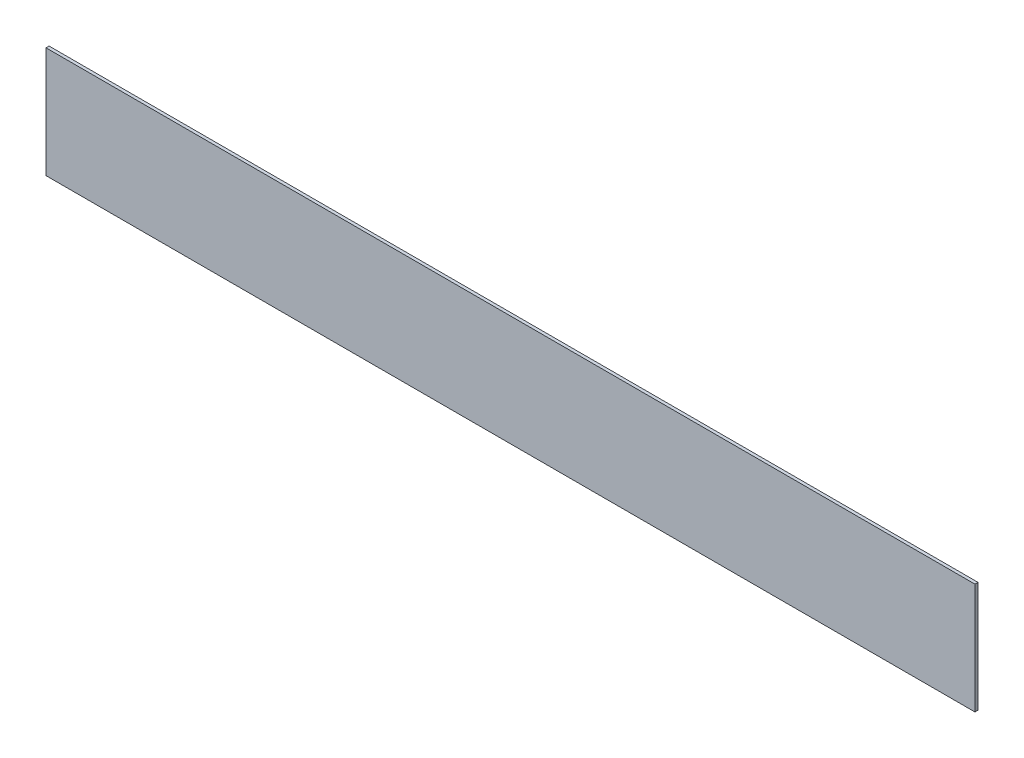
ISO-10303-21;
HEADER;
FILE_DESCRIPTION(('STEP AP214'),'2;1');
FILE_NAME('part.step','',(''),(''),'','','');
FILE_SCHEMA(('AUTOMOTIVE_DESIGN { 1 0 10303 214 1 1 1 1 }'));
ENDSEC;
DATA;
#1=APPLICATION_CONTEXT('core data for automotive mechanical design processes');
#2=APPLICATION_PROTOCOL_DEFINITION('international standard','automotive_design',2000,#1);
#3=PRODUCT_CONTEXT('',#1,'mechanical');
#4=PRODUCT('Part','Part','',(#3));
#5=PRODUCT_RELATED_PRODUCT_CATEGORY('part','',(#4));
#6=PRODUCT_DEFINITION_FORMATION('','',#4);
#7=PRODUCT_DEFINITION_CONTEXT('part definition',#1,'design');
#8=PRODUCT_DEFINITION('design','',#6,#7);
#9=PRODUCT_DEFINITION_SHAPE('','',#8);
#10=(LENGTH_UNIT() NAMED_UNIT(*) SI_UNIT(.MILLI.,.METRE.));
#11=(NAMED_UNIT(*) PLANE_ANGLE_UNIT() SI_UNIT($,.RADIAN.));
#12=(NAMED_UNIT(*) SI_UNIT($,.STERADIAN.) SOLID_ANGLE_UNIT());
#13=UNCERTAINTY_MEASURE_WITH_UNIT(LENGTH_MEASURE(1.E-05),#10,'distance_accuracy_value','');
#14=(GEOMETRIC_REPRESENTATION_CONTEXT(3) GLOBAL_UNCERTAINTY_ASSIGNED_CONTEXT((#13)) GLOBAL_UNIT_ASSIGNED_CONTEXT((#10,
#11,#12)) REPRESENTATION_CONTEXT('',''));
#15=CARTESIAN_POINT('',(0.,0.,0.));
#16=DIRECTION('',(0.,0.,1.));
#17=DIRECTION('',(1.,0.,0.));
#18=AXIS2_PLACEMENT_3D('',#15,#16,#17);
#19=CARTESIAN_POINT('',(158.,27.,27.));
#20=DIRECTION('',(1.,0.,0.));
#21=DIRECTION('',(0.,0.,-1.));
#22=AXIS2_PLACEMENT_3D('',#19,#20,#21);
#23=PLANE('',#22);
#24=DIRECTION('',(0.,-1.,0.));
#25=VECTOR('',#24,1.);
#26=CARTESIAN_POINT('',(158.,27.,26.));
#27=LINE('',#26,#25);
#28=CARTESIAN_POINT('',(158.,63.,26.));
#29=VERTEX_POINT('',#28);
#30=CARTESIAN_POINT('',(158.,27.,26.));
#31=VERTEX_POINT('',#30);
#32=EDGE_CURVE('E102',#29,#31,#27,.T.);
#33=ORIENTED_EDGE('',*,*,#32,.T.);
#34=DIRECTION('',(0.,0.,-1.));
#35=VECTOR('',#34,1.);
#36=CARTESIAN_POINT('',(158.,27.,27.));
#37=LINE('',#36,#35);
#38=CARTESIAN_POINT('',(158.,27.,27.));
#39=VERTEX_POINT('',#38);
#40=EDGE_CURVE('E11',#39,#31,#37,.T.);
#41=ORIENTED_EDGE('',*,*,#40,.F.);
#42=DIRECTION('',(0.,-1.,0.));
#43=VECTOR('',#42,1.);
#44=CARTESIAN_POINT('',(158.,27.,27.));
#45=LINE('',#44,#43);
#46=CARTESIAN_POINT('',(158.,63.,27.));
#47=VERTEX_POINT('',#46);
#48=EDGE_CURVE('E90',#47,#39,#45,.T.);
#49=ORIENTED_EDGE('',*,*,#48,.F.);
#50=DIRECTION('',(0.,0.,-1.));
#51=VECTOR('',#50,1.);
#52=CARTESIAN_POINT('',(158.,63.,27.));
#53=LINE('',#52,#51);
#54=EDGE_CURVE('E98',#47,#29,#53,.T.);
#55=ORIENTED_EDGE('',*,*,#54,.T.);
#56=EDGE_LOOP('',(#33,#41,#49,#55));
#57=FACE_BOUND('',#56,.T.);
#58=ADVANCED_FACE('F39',(#57),#23,.F.);
#59=CARTESIAN_POINT('',(158.,27.,27.));
#60=DIRECTION('',(0.,1.,0.));
#61=DIRECTION('',(0.,0.,1.));
#62=AXIS2_PLACEMENT_3D('',#59,#60,#61);
#63=PLANE('',#62);
#64=DIRECTION('',(1.,0.,0.));
#65=VECTOR('',#64,1.);
#66=CARTESIAN_POINT('',(158.,27.,26.));
#67=LINE('',#66,#65);
#68=CARTESIAN_POINT('',(460.,27.,26.));
#69=VERTEX_POINT('',#68);
#70=EDGE_CURVE('E94',#31,#69,#67,.T.);
#71=ORIENTED_EDGE('',*,*,#70,.T.);
#72=DIRECTION('',(0.,0.,-1.));
#73=VECTOR('',#72,1.);
#74=CARTESIAN_POINT('',(460.,27.,27.));
#75=LINE('',#74,#73);
#76=CARTESIAN_POINT('',(460.,27.,27.));
#77=VERTEX_POINT('',#76);
#78=EDGE_CURVE('E47',#77,#69,#75,.T.);
#79=ORIENTED_EDGE('',*,*,#78,.F.);
#80=DIRECTION('',(1.,0.,0.));
#81=VECTOR('',#80,1.);
#82=CARTESIAN_POINT('',(158.,27.,27.));
#83=LINE('',#82,#81);
#84=EDGE_CURVE('E85',#39,#77,#83,.T.);
#85=ORIENTED_EDGE('',*,*,#84,.F.);
#86=ORIENTED_EDGE('',*,*,#40,.T.);
#87=EDGE_LOOP('',(#71,#79,#85,#86));
#88=FACE_BOUND('',#87,.T.);
#89=ADVANCED_FACE('F93',(#88),#63,.F.);
#90=CARTESIAN_POINT('',(460.,27.,27.));
#91=DIRECTION('',(-1.,0.,0.));
#92=DIRECTION('',(0.,0.,1.));
#93=AXIS2_PLACEMENT_3D('',#90,#91,#92);
#94=PLANE('',#93);
#95=DIRECTION('',(0.,1.,0.));
#96=VECTOR('',#95,1.);
#97=CARTESIAN_POINT('',(460.,27.,26.));
#98=LINE('',#97,#96);
#99=CARTESIAN_POINT('',(460.,63.,26.));
#100=VERTEX_POINT('',#99);
#101=EDGE_CURVE('E72',#69,#100,#98,.T.);
#102=ORIENTED_EDGE('',*,*,#101,.T.);
#103=DIRECTION('',(0.,0.,-1.));
#104=VECTOR('',#103,1.);
#105=CARTESIAN_POINT('',(460.,63.,27.));
#106=LINE('',#105,#104);
#107=CARTESIAN_POINT('',(460.,63.,27.));
#108=VERTEX_POINT('',#107);
#109=EDGE_CURVE('E95',#108,#100,#106,.T.);
#110=ORIENTED_EDGE('',*,*,#109,.F.);
#111=DIRECTION('',(0.,1.,0.));
#112=VECTOR('',#111,1.);
#113=CARTESIAN_POINT('',(460.,27.,27.));
#114=LINE('',#113,#112);
#115=EDGE_CURVE('E88',#77,#108,#114,.T.);
#116=ORIENTED_EDGE('',*,*,#115,.F.);
#117=ORIENTED_EDGE('',*,*,#78,.T.);
#118=EDGE_LOOP('',(#102,#110,#116,#117));
#119=FACE_BOUND('',#118,.T.);
#120=ADVANCED_FACE('F96',(#119),#94,.F.);
#121=CARTESIAN_POINT('',(158.,63.,27.));
#122=DIRECTION('',(0.,-1.,0.));
#123=DIRECTION('',(0.,0.,-1.));
#124=AXIS2_PLACEMENT_3D('',#121,#122,#123);
#125=PLANE('',#124);
#126=DIRECTION('',(-1.,0.,0.));
#127=VECTOR('',#126,1.);
#128=CARTESIAN_POINT('',(158.,63.,26.));
#129=LINE('',#128,#127);
#130=EDGE_CURVE('E78',#100,#29,#129,.T.);
#131=ORIENTED_EDGE('',*,*,#130,.T.);
#132=ORIENTED_EDGE('',*,*,#54,.F.);
#133=DIRECTION('',(-1.,0.,0.));
#134=VECTOR('',#133,1.);
#135=CARTESIAN_POINT('',(158.,63.,27.));
#136=LINE('',#135,#134);
#137=EDGE_CURVE('E55',#108,#47,#136,.T.);
#138=ORIENTED_EDGE('',*,*,#137,.F.);
#139=ORIENTED_EDGE('',*,*,#109,.T.);
#140=EDGE_LOOP('',(#131,#132,#138,#139));
#141=FACE_BOUND('',#140,.T.);
#142=ADVANCED_FACE('F109',(#141),#125,.F.);
#143=CARTESIAN_POINT('',(0.,0.,27.));
#144=DIRECTION('',(0.,0.,-1.));
#145=DIRECTION('',(-1.,0.,0.));
#146=AXIS2_PLACEMENT_3D('',#143,#144,#145);
#147=PLANE('',#146);
#148=ORIENTED_EDGE('',*,*,#48,.T.);
#149=ORIENTED_EDGE('',*,*,#84,.T.);
#150=ORIENTED_EDGE('',*,*,#115,.T.);
#151=ORIENTED_EDGE('',*,*,#137,.T.);
#152=EDGE_LOOP('',(#148,#149,#150,#151));
#153=FACE_BOUND('',#152,.T.);
#154=ADVANCED_FACE('F86',(#153),#147,.F.);
#155=CARTESIAN_POINT('',(0.,0.,26.));
#156=DIRECTION('',(0.,0.,-1.));
#157=DIRECTION('',(-1.,0.,0.));
#158=AXIS2_PLACEMENT_3D('',#155,#156,#157);
#159=PLANE('',#158);
#160=ORIENTED_EDGE('',*,*,#32,.F.);
#161=ORIENTED_EDGE('',*,*,#130,.F.);
#162=ORIENTED_EDGE('',*,*,#101,.F.);
#163=ORIENTED_EDGE('',*,*,#70,.F.);
#164=EDGE_LOOP('',(#160,#161,#162,#163));
#165=FACE_BOUND('',#164,.T.);
#166=ADVANCED_FACE('F112',(#165),#159,.T.);
#167=CLOSED_SHELL('',(#58,#89,#120,#142,#154,#166));
#168=MANIFOLD_SOLID_BREP('B2',#167);
#169=ADVANCED_BREP_SHAPE_REPRESENTATION('',(#18,#168),#14);
#170=SHAPE_DEFINITION_REPRESENTATION(#9,#169);
ENDSEC;
END-ISO-10303-21;
